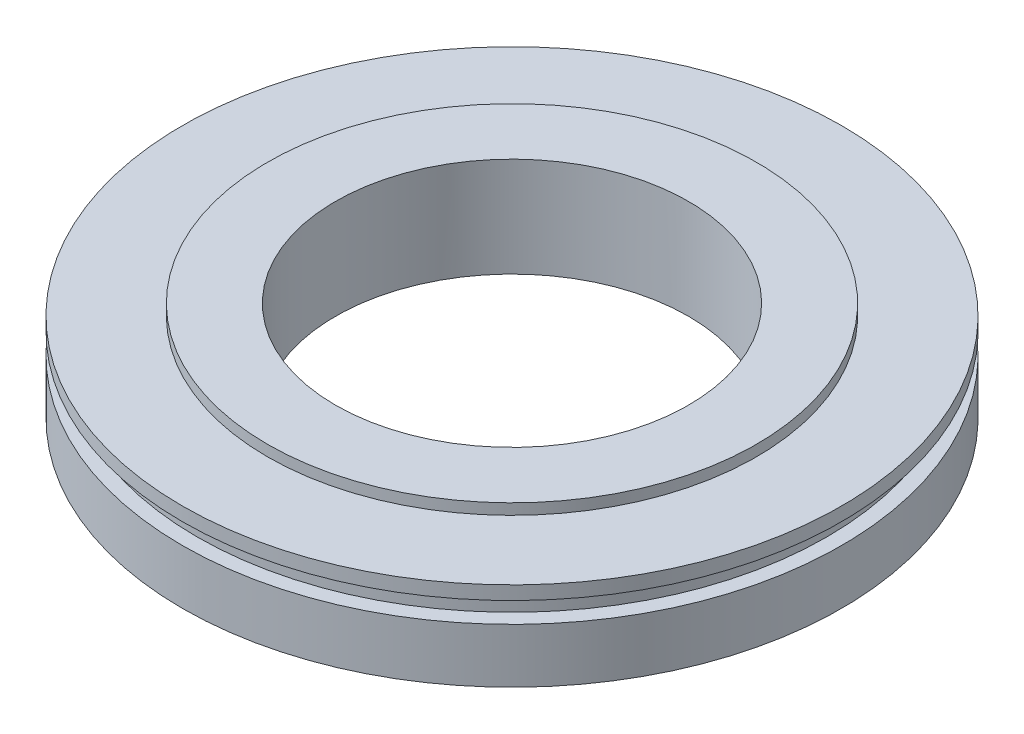
ISO-10303-21;
HEADER;
FILE_DESCRIPTION(('STEP AP214'),'2;1');
FILE_NAME('part.step','',(''),(''),'','','');
FILE_SCHEMA(('AUTOMOTIVE_DESIGN { 1 0 10303 214 1 1 1 1 }'));
ENDSEC;
DATA;
#1=APPLICATION_CONTEXT('core data for automotive mechanical design processes');
#2=APPLICATION_PROTOCOL_DEFINITION('international standard','automotive_design',2000,#1);
#3=PRODUCT_CONTEXT('',#1,'mechanical');
#4=PRODUCT('Part','Part','',(#3));
#5=PRODUCT_RELATED_PRODUCT_CATEGORY('part','',(#4));
#6=PRODUCT_DEFINITION_FORMATION('','',#4);
#7=PRODUCT_DEFINITION_CONTEXT('part definition',#1,'design');
#8=PRODUCT_DEFINITION('design','',#6,#7);
#9=PRODUCT_DEFINITION_SHAPE('','',#8);
#10=(LENGTH_UNIT() NAMED_UNIT(*) SI_UNIT(.MILLI.,.METRE.));
#11=(NAMED_UNIT(*) PLANE_ANGLE_UNIT() SI_UNIT($,.RADIAN.));
#12=(NAMED_UNIT(*) SI_UNIT($,.STERADIAN.) SOLID_ANGLE_UNIT());
#13=UNCERTAINTY_MEASURE_WITH_UNIT(LENGTH_MEASURE(1.E-05),#10,'distance_accuracy_value','');
#14=(GEOMETRIC_REPRESENTATION_CONTEXT(3) GLOBAL_UNCERTAINTY_ASSIGNED_CONTEXT((#13)) GLOBAL_UNIT_ASSIGNED_CONTEXT((#10,
#11,#12)) REPRESENTATION_CONTEXT('',''));
#15=CARTESIAN_POINT('',(0.,0.,0.));
#16=DIRECTION('',(0.,0.,1.));
#17=DIRECTION('',(1.,0.,0.));
#18=AXIS2_PLACEMENT_3D('',#15,#16,#17);
#19=CARTESIAN_POINT('',(0.,2.69408399999959,30.8229));
#20=DIRECTION('',(0.,1.,0.));
#21=DIRECTION('',(0.,0.,1.));
#22=AXIS2_PLACEMENT_3D('',#19,#20,#21);
#23=PLANE('',#22);
#24=CARTESIAN_POINT('',(0.,2.69408399999959,0.));
#25=DIRECTION('',(0.,1.,0.));
#26=DIRECTION('',(0.,0.,1.));
#27=AXIS2_PLACEMENT_3D('',#24,#25,#26);
#28=CIRCLE('',#27,30.8229);
#29=CARTESIAN_POINT('',(0.,2.69408399999959,30.8229));
#30=VERTEX_POINT('',#29);
#31=EDGE_CURVE('E58',#30,#30,#28,.T.);
#32=ORIENTED_EDGE('',*,*,#31,.T.);
#33=EDGE_LOOP('',(#32));
#34=FACE_BOUND('',#33,.T.);
#35=CARTESIAN_POINT('',(0.,2.69408399999959,0.));
#36=DIRECTION('',(0.,1.,0.));
#37=DIRECTION('',(0.,0.,1.));
#38=AXIS2_PLACEMENT_3D('',#35,#36,#37);
#39=CIRCLE('',#38,22.86);
#40=CARTESIAN_POINT('',(0.,2.69408399999959,22.86));
#41=VERTEX_POINT('',#40);
#42=EDGE_CURVE('E62',#41,#41,#39,.T.);
#43=ORIENTED_EDGE('',*,*,#42,.F.);
#44=EDGE_LOOP('',(#43));
#45=FACE_BOUND('',#44,.T.);
#46=ADVANCED_FACE('F39',(#34,#45),#23,.T.);
#47=CARTESIAN_POINT('',(0.,0.,0.));
#48=DIRECTION('',(0.,1.,0.));
#49=DIRECTION('',(0.,0.,1.));
#50=AXIS2_PLACEMENT_3D('',#47,#48,#49);
#51=CYLINDRICAL_SURFACE('',#50,16.51);
#52=CARTESIAN_POINT('',(0.,3.71008399999959,0.));
#53=DIRECTION('',(0.,1.,0.));
#54=DIRECTION('',(0.,0.,1.));
#55=AXIS2_PLACEMENT_3D('',#52,#53,#54);
#56=CIRCLE('',#55,16.51);
#57=CARTESIAN_POINT('',(0.,3.71008399999959,16.51));
#58=VERTEX_POINT('',#57);
#59=EDGE_CURVE('E65',#58,#58,#56,.T.);
#60=ORIENTED_EDGE('',*,*,#59,.T.);
#61=EDGE_LOOP('',(#60));
#62=FACE_BOUND('',#61,.T.);
#63=CARTESIAN_POINT('',(0.,-5.59993800000016,0.));
#64=DIRECTION('',(0.,-1.,0.));
#65=DIRECTION('',(0.,0.,-1.));
#66=AXIS2_PLACEMENT_3D('',#63,#64,#65);
#67=CIRCLE('',#66,16.51);
#68=CARTESIAN_POINT('',(0.,-5.59993800000016,-16.51));
#69=VERTEX_POINT('',#68);
#70=EDGE_CURVE('E73',#69,#69,#67,.T.);
#71=ORIENTED_EDGE('',*,*,#70,.T.);
#72=EDGE_LOOP('',(#71));
#73=FACE_BOUND('',#72,.T.);
#74=ADVANCED_FACE('F77',(#62,#73),#51,.F.);
#75=CARTESIAN_POINT('',(0.,0.,0.));
#76=DIRECTION('',(0.,1.,0.));
#77=DIRECTION('',(0.,0.,1.));
#78=AXIS2_PLACEMENT_3D('',#75,#76,#77);
#79=CYLINDRICAL_SURFACE('',#78,30.8229);
#80=CARTESIAN_POINT('',(0.,-0.50631600000041,0.));
#81=DIRECTION('',(0.,1.,0.));
#82=DIRECTION('',(0.,0.,1.));
#83=AXIS2_PLACEMENT_3D('',#80,#81,#82);
#84=CIRCLE('',#83,30.8229);
#85=CARTESIAN_POINT('',(0.,-0.50631600000041,30.8229));
#86=VERTEX_POINT('',#85);
#87=EDGE_CURVE('E10',#86,#86,#84,.T.);
#88=ORIENTED_EDGE('',*,*,#87,.F.);
#89=EDGE_LOOP('',(#88));
#90=FACE_BOUND('',#89,.T.);
#91=CARTESIAN_POINT('',(0.,-5.59993800000016,0.));
#92=DIRECTION('',(0.,-1.,0.));
#93=DIRECTION('',(0.,0.,-1.));
#94=AXIS2_PLACEMENT_3D('',#91,#92,#93);
#95=CIRCLE('',#94,30.8229);
#96=CARTESIAN_POINT('',(0.,-5.59993800000016,-30.8229));
#97=VERTEX_POINT('',#96);
#98=EDGE_CURVE('E70',#97,#97,#95,.T.);
#99=ORIENTED_EDGE('',*,*,#98,.F.);
#100=EDGE_LOOP('',(#99));
#101=FACE_BOUND('',#100,.T.);
#102=ADVANCED_FACE('F99',(#90,#101),#79,.T.);
#103=CARTESIAN_POINT('',(0.,-0.50631600000041,29.4386));
#104=DIRECTION('',(0.,1.,0.));
#105=DIRECTION('',(0.,0.,1.));
#106=AXIS2_PLACEMENT_3D('',#103,#104,#105);
#107=PLANE('',#106);
#108=ORIENTED_EDGE('',*,*,#87,.T.);
#109=EDGE_LOOP('',(#108));
#110=FACE_BOUND('',#109,.T.);
#111=CARTESIAN_POINT('',(0.,-0.50631600000041,0.));
#112=DIRECTION('',(0.,1.,0.));
#113=DIRECTION('',(0.,0.,1.));
#114=AXIS2_PLACEMENT_3D('',#111,#112,#113);
#115=CIRCLE('',#114,29.4386);
#116=CARTESIAN_POINT('',(0.,-0.50631600000041,29.4386));
#117=VERTEX_POINT('',#116);
#118=EDGE_CURVE('E45',#117,#117,#115,.T.);
#119=ORIENTED_EDGE('',*,*,#118,.F.);
#120=EDGE_LOOP('',(#119));
#121=FACE_BOUND('',#120,.T.);
#122=ADVANCED_FACE('F120',(#110,#121),#107,.T.);
#123=CARTESIAN_POINT('',(0.,0.,0.));
#124=DIRECTION('',(0.,1.,0.));
#125=DIRECTION('',(0.,0.,1.));
#126=AXIS2_PLACEMENT_3D('',#123,#124,#125);
#127=CYLINDRICAL_SURFACE('',#126,29.4386);
#128=ORIENTED_EDGE('',*,*,#118,.T.);
#129=EDGE_LOOP('',(#128));
#130=FACE_BOUND('',#129,.T.);
#131=CARTESIAN_POINT('',(0.,1.42408399999959,0.));
#132=DIRECTION('',(0.,1.,0.));
#133=DIRECTION('',(0.,0.,1.));
#134=AXIS2_PLACEMENT_3D('',#131,#132,#133);
#135=CIRCLE('',#134,29.4386);
#136=CARTESIAN_POINT('',(0.,1.42408399999959,29.4386));
#137=VERTEX_POINT('',#136);
#138=EDGE_CURVE('E49',#137,#137,#135,.T.);
#139=ORIENTED_EDGE('',*,*,#138,.F.);
#140=EDGE_LOOP('',(#139));
#141=FACE_BOUND('',#140,.T.);
#142=ADVANCED_FACE('F114',(#130,#141),#127,.T.);
#143=CARTESIAN_POINT('',(0.,1.42408399999959,30.8229));
#144=DIRECTION('',(0.,-1.,0.));
#145=DIRECTION('',(0.,0.,-1.));
#146=AXIS2_PLACEMENT_3D('',#143,#144,#145);
#147=PLANE('',#146);
#148=ORIENTED_EDGE('',*,*,#138,.T.);
#149=EDGE_LOOP('',(#148));
#150=FACE_BOUND('',#149,.T.);
#151=CARTESIAN_POINT('',(0.,1.42408399999959,0.));
#152=DIRECTION('',(0.,1.,0.));
#153=DIRECTION('',(0.,0.,1.));
#154=AXIS2_PLACEMENT_3D('',#151,#152,#153);
#155=CIRCLE('',#154,30.8229);
#156=CARTESIAN_POINT('',(0.,1.42408399999959,30.8229));
#157=VERTEX_POINT('',#156);
#158=EDGE_CURVE('E53',#157,#157,#155,.T.);
#159=ORIENTED_EDGE('',*,*,#158,.F.);
#160=EDGE_LOOP('',(#159));
#161=FACE_BOUND('',#160,.T.);
#162=ADVANCED_FACE('F107',(#150,#161),#147,.T.);
#163=CARTESIAN_POINT('',(0.,0.,0.));
#164=DIRECTION('',(0.,1.,0.));
#165=DIRECTION('',(0.,0.,1.));
#166=AXIS2_PLACEMENT_3D('',#163,#164,#165);
#167=CYLINDRICAL_SURFACE('',#166,30.8229);
#168=ORIENTED_EDGE('',*,*,#158,.T.);
#169=EDGE_LOOP('',(#168));
#170=FACE_BOUND('',#169,.T.);
#171=ORIENTED_EDGE('',*,*,#31,.F.);
#172=EDGE_LOOP('',(#171));
#173=FACE_BOUND('',#172,.T.);
#174=ADVANCED_FACE('F106',(#170,#173),#167,.T.);
#175=CARTESIAN_POINT('',(0.,3.71008399999959,0.));
#176=DIRECTION('',(0.,1.,0.));
#177=DIRECTION('',(0.,0.,1.));
#178=AXIS2_PLACEMENT_3D('',#175,#176,#177);
#179=PLANE('',#178);
#180=CARTESIAN_POINT('',(0.,3.71008399999959,0.));
#181=DIRECTION('',(0.,1.,0.));
#182=DIRECTION('',(0.,0.,1.));
#183=AXIS2_PLACEMENT_3D('',#180,#181,#182);
#184=CIRCLE('',#183,22.86);
#185=CARTESIAN_POINT('',(0.,3.71008399999959,22.86));
#186=VERTEX_POINT('',#185);
#187=EDGE_CURVE('E61',#186,#186,#184,.T.);
#188=ORIENTED_EDGE('',*,*,#187,.T.);
#189=EDGE_LOOP('',(#188));
#190=FACE_BOUND('',#189,.T.);
#191=ORIENTED_EDGE('',*,*,#59,.F.);
#192=EDGE_LOOP('',(#191));
#193=FACE_BOUND('',#192,.T.);
#194=ADVANCED_FACE('F88',(#190,#193),#179,.T.);
#195=CARTESIAN_POINT('',(0.,3.71008399999959,0.));
#196=DIRECTION('',(0.,-1.,0.));
#197=DIRECTION('',(0.,0.,-1.));
#198=AXIS2_PLACEMENT_3D('',#195,#196,#197);
#199=CYLINDRICAL_SURFACE('',#198,22.86);
#200=ORIENTED_EDGE('',*,*,#187,.F.);
#201=EDGE_LOOP('',(#200));
#202=FACE_BOUND('',#201,.T.);
#203=ORIENTED_EDGE('',*,*,#42,.T.);
#204=EDGE_LOOP('',(#203));
#205=FACE_BOUND('',#204,.T.);
#206=ADVANCED_FACE('F81',(#202,#205),#199,.T.);
#207=CARTESIAN_POINT('',(0.,-5.59993800000016,0.));
#208=DIRECTION('',(0.,-1.,0.));
#209=DIRECTION('',(0.,0.,-1.));
#210=AXIS2_PLACEMENT_3D('',#207,#208,#209);
#211=PLANE('',#210);
#212=ORIENTED_EDGE('',*,*,#98,.T.);
#213=EDGE_LOOP('',(#212));
#214=FACE_BOUND('',#213,.T.);
#215=ORIENTED_EDGE('',*,*,#70,.F.);
#216=EDGE_LOOP('',(#215));
#217=FACE_BOUND('',#216,.T.);
#218=ADVANCED_FACE('F79',(#214,#217),#211,.T.);
#219=CLOSED_SHELL('',(#46,#74,#102,#122,#142,#162,#174,#194,#206,#218));
#220=MANIFOLD_SOLID_BREP('B2',#219);
#221=ADVANCED_BREP_SHAPE_REPRESENTATION('',(#18,#220),#14);
#222=SHAPE_DEFINITION_REPRESENTATION(#9,#221);
ENDSEC;
END-ISO-10303-21;
